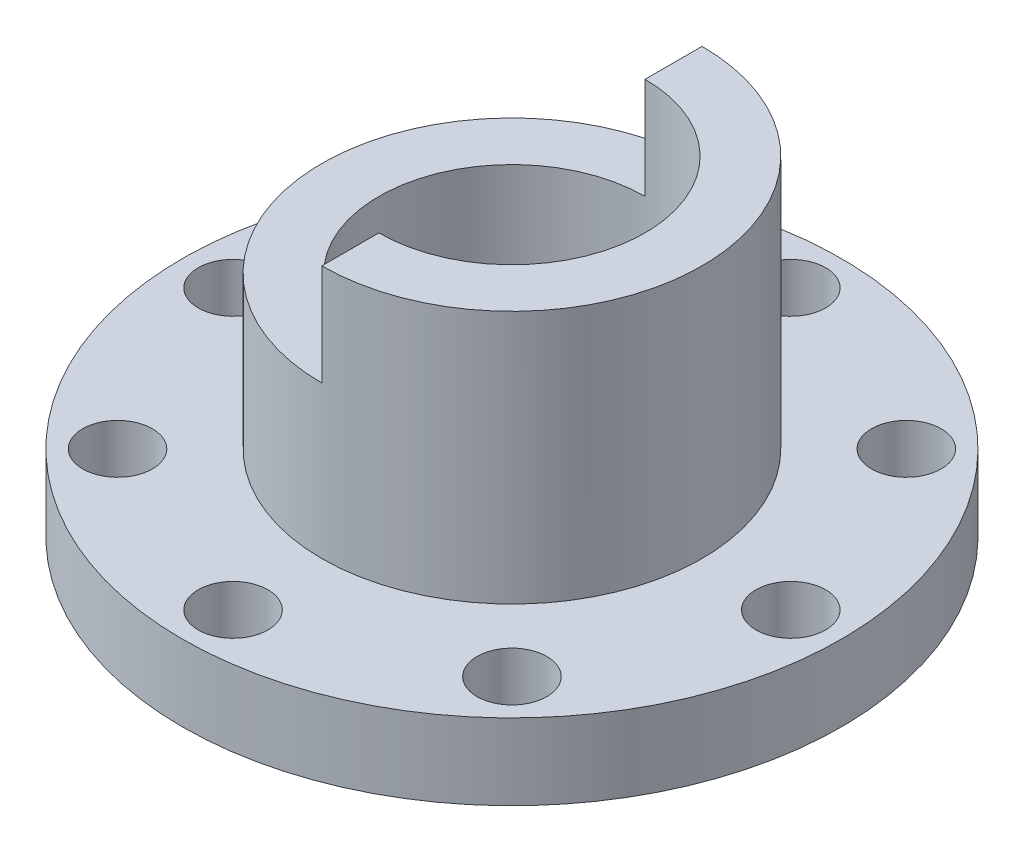
ISO-10303-21;
HEADER;
FILE_DESCRIPTION(('STEP AP214'),'2;1');
FILE_NAME('part.step','',(''),(''),'','','');
FILE_SCHEMA(('AUTOMOTIVE_DESIGN { 1 0 10303 214 1 1 1 1 }'));
ENDSEC;
DATA;
#1=APPLICATION_CONTEXT('core data for automotive mechanical design processes');
#2=APPLICATION_PROTOCOL_DEFINITION('international standard','automotive_design',2000,#1);
#3=PRODUCT_CONTEXT('',#1,'mechanical');
#4=PRODUCT('Part','Part','',(#3));
#5=PRODUCT_RELATED_PRODUCT_CATEGORY('part','',(#4));
#6=PRODUCT_DEFINITION_FORMATION('','',#4);
#7=PRODUCT_DEFINITION_CONTEXT('part definition',#1,'design');
#8=PRODUCT_DEFINITION('design','',#6,#7);
#9=PRODUCT_DEFINITION_SHAPE('','',#8);
#10=(LENGTH_UNIT() NAMED_UNIT(*) SI_UNIT(.MILLI.,.METRE.));
#11=(NAMED_UNIT(*) PLANE_ANGLE_UNIT() SI_UNIT($,.RADIAN.));
#12=(NAMED_UNIT(*) SI_UNIT($,.STERADIAN.) SOLID_ANGLE_UNIT());
#13=UNCERTAINTY_MEASURE_WITH_UNIT(LENGTH_MEASURE(1.E-05),#10,'distance_accuracy_value','');
#14=(GEOMETRIC_REPRESENTATION_CONTEXT(3) GLOBAL_UNCERTAINTY_ASSIGNED_CONTEXT((#13)) GLOBAL_UNIT_ASSIGNED_CONTEXT((#10,
#11,#12)) REPRESENTATION_CONTEXT('',''));
#15=CARTESIAN_POINT('',(0.,0.,0.));
#16=DIRECTION('',(0.,0.,1.));
#17=DIRECTION('',(1.,0.,0.));
#18=AXIS2_PLACEMENT_3D('',#15,#16,#17);
#19=CARTESIAN_POINT('',(0.,9.,0.));
#20=DIRECTION('',(0.,1.,0.));
#21=DIRECTION('',(0.,0.,1.));
#22=AXIS2_PLACEMENT_3D('',#19,#20,#21);
#23=PLANE('',#22);
#24=DIRECTION('',(0.,0.,1.));
#25=VECTOR('',#24,1.);
#26=CARTESIAN_POINT('',(0.,9.,0.));
#27=LINE('',#26,#25);
#28=CARTESIAN_POINT('',(0.,9.,-7.5));
#29=VERTEX_POINT('',#28);
#30=CARTESIAN_POINT('',(0.,9.,-5.25));
#31=VERTEX_POINT('',#30);
#32=EDGE_CURVE('E113',#29,#31,#27,.T.);
#33=ORIENTED_EDGE('',*,*,#32,.F.);
#34=CARTESIAN_POINT('',(0.,9.,0.));
#35=DIRECTION('',(0.,1.,0.));
#36=DIRECTION('',(0.,0.,1.));
#37=AXIS2_PLACEMENT_3D('',#34,#35,#36);
#38=CIRCLE('',#37,7.5);
#39=CARTESIAN_POINT('',(0.,9.,7.5));
#40=VERTEX_POINT('',#39);
#41=EDGE_CURVE('E94',#29,#40,#38,.T.);
#42=ORIENTED_EDGE('',*,*,#41,.T.);
#43=CARTESIAN_POINT('',(0.,9.,5.25));
#44=VERTEX_POINT('',#43);
#45=EDGE_CURVE('E57',#44,#40,#27,.T.);
#46=ORIENTED_EDGE('',*,*,#45,.F.);
#47=CARTESIAN_POINT('',(0.,9.,0.));
#48=DIRECTION('',(0.,1.,0.));
#49=DIRECTION('',(0.,0.,1.));
#50=AXIS2_PLACEMENT_3D('',#47,#48,#49);
#51=CIRCLE('',#50,5.25);
#52=EDGE_CURVE('E116',#44,#31,#51,.F.);
#53=ORIENTED_EDGE('',*,*,#52,.T.);
#54=EDGE_LOOP('',(#33,#42,#46,#53));
#55=FACE_BOUND('',#54,.T.);
#56=ADVANCED_FACE('F41',(#55),#23,.T.);
#57=CARTESIAN_POINT('',(0.,13.,0.));
#58=DIRECTION('',(0.,1.,0.));
#59=DIRECTION('',(0.,0.,1.));
#60=AXIS2_PLACEMENT_3D('',#57,#58,#59);
#61=PLANE('',#60);
#62=DIRECTION('',(0.,0.,1.));
#63=VECTOR('',#62,1.);
#64=CARTESIAN_POINT('',(0.,13.,0.));
#65=LINE('',#64,#63);
#66=CARTESIAN_POINT('',(0.,13.,5.25));
#67=VERTEX_POINT('',#66);
#68=CARTESIAN_POINT('',(0.,13.,7.5));
#69=VERTEX_POINT('',#68);
#70=EDGE_CURVE('E93',#67,#69,#65,.T.);
#71=ORIENTED_EDGE('',*,*,#70,.T.);
#72=CARTESIAN_POINT('',(0.,13.,0.));
#73=DIRECTION('',(0.,1.,0.));
#74=DIRECTION('',(0.,0.,1.));
#75=AXIS2_PLACEMENT_3D('',#72,#73,#74);
#76=CIRCLE('',#75,7.5);
#77=CARTESIAN_POINT('',(0.,13.,-7.5));
#78=VERTEX_POINT('',#77);
#79=EDGE_CURVE('E97',#69,#78,#76,.T.);
#80=ORIENTED_EDGE('',*,*,#79,.T.);
#81=CARTESIAN_POINT('',(0.,13.,-5.25));
#82=VERTEX_POINT('',#81);
#83=EDGE_CURVE('E82',#78,#82,#65,.T.);
#84=ORIENTED_EDGE('',*,*,#83,.T.);
#85=CARTESIAN_POINT('',(0.,13.,0.));
#86=DIRECTION('',(0.,1.,0.));
#87=DIRECTION('',(0.,0.,1.));
#88=AXIS2_PLACEMENT_3D('',#85,#86,#87);
#89=CIRCLE('',#88,5.25);
#90=EDGE_CURVE('E122',#67,#82,#89,.T.);
#91=ORIENTED_EDGE('',*,*,#90,.F.);
#92=EDGE_LOOP('',(#71,#80,#84,#91));
#93=FACE_BOUND('',#92,.T.);
#94=ADVANCED_FACE('F98',(#93),#61,.T.);
#95=CARTESIAN_POINT('',(0.,9.,0.));
#96=DIRECTION('',(-1.,0.,0.));
#97=DIRECTION('',(0.,0.,1.));
#98=AXIS2_PLACEMENT_3D('',#95,#96,#97);
#99=PLANE('',#98);
#100=ORIENTED_EDGE('',*,*,#83,.F.);
#101=DIRECTION('',(0.,-1.,0.));
#102=VECTOR('',#101,1.);
#103=CARTESIAN_POINT('',(0.,13.,-7.5));
#104=LINE('',#103,#102);
#105=EDGE_CURVE('E86',#78,#29,#104,.T.);
#106=ORIENTED_EDGE('',*,*,#105,.T.);
#107=ORIENTED_EDGE('',*,*,#32,.T.);
#108=DIRECTION('',(0.,1.,0.));
#109=VECTOR('',#108,1.);
#110=CARTESIAN_POINT('',(0.,9.,-5.25));
#111=LINE('',#110,#109);
#112=EDGE_CURVE('E88',#31,#82,#111,.T.);
#113=ORIENTED_EDGE('',*,*,#112,.T.);
#114=EDGE_LOOP('',(#100,#106,#107,#113));
#115=FACE_BOUND('',#114,.T.);
#116=ADVANCED_FACE('F84',(#115),#99,.T.);
#117=ORIENTED_EDGE('',*,*,#45,.T.);
#118=DIRECTION('',(0.,-1.,0.));
#119=VECTOR('',#118,1.);
#120=CARTESIAN_POINT('',(0.,13.,7.5));
#121=LINE('',#120,#119);
#122=EDGE_CURVE('E102',#69,#40,#121,.T.);
#123=ORIENTED_EDGE('',*,*,#122,.F.);
#124=ORIENTED_EDGE('',*,*,#70,.F.);
#125=DIRECTION('',(0.,1.,0.));
#126=VECTOR('',#125,1.);
#127=CARTESIAN_POINT('',(0.,9.,5.25));
#128=LINE('',#127,#126);
#129=EDGE_CURVE('E118',#44,#67,#128,.T.);
#130=ORIENTED_EDGE('',*,*,#129,.F.);
#131=EDGE_LOOP('',(#117,#123,#124,#130));
#132=FACE_BOUND('',#131,.T.);
#133=ADVANCED_FACE('F228',(#132),#99,.T.);
#134=CARTESIAN_POINT('',(0.,-5.,0.));
#135=DIRECTION('',(0.,1.,0.));
#136=DIRECTION('',(0.,0.,1.));
#137=AXIS2_PLACEMENT_3D('',#134,#135,#136);
#138=CYLINDRICAL_SURFACE('',#137,5.25);
#139=ORIENTED_EDGE('',*,*,#112,.F.);
#140=ORIENTED_EDGE('',*,*,#52,.F.);
#141=ORIENTED_EDGE('',*,*,#129,.T.);
#142=ORIENTED_EDGE('',*,*,#90,.T.);
#143=EDGE_LOOP('',(#139,#140,#141,#142));
#144=FACE_BOUND('',#143,.T.);
#145=CARTESIAN_POINT('',(0.,0.,0.));
#146=DIRECTION('',(0.,1.,0.));
#147=DIRECTION('',(0.,0.,1.));
#148=AXIS2_PLACEMENT_3D('',#145,#146,#147);
#149=CIRCLE('',#148,5.25);
#150=CARTESIAN_POINT('',(0.,0.,5.25));
#151=VERTEX_POINT('',#150);
#152=EDGE_CURVE('E128',#151,#151,#149,.T.);
#153=ORIENTED_EDGE('',*,*,#152,.F.);
#154=EDGE_LOOP('',(#153));
#155=FACE_BOUND('',#154,.T.);
#156=ADVANCED_FACE('F229',(#144,#155),#138,.F.);
#157=CARTESIAN_POINT('',(0.,3.,0.));
#158=DIRECTION('',(0.,1.,0.));
#159=DIRECTION('',(0.,0.,1.));
#160=AXIS2_PLACEMENT_3D('',#157,#158,#159);
#161=PLANE('',#160);
#162=CARTESIAN_POINT('',(0.,3.,0.));
#163=DIRECTION('',(0.,1.,0.));
#164=DIRECTION('',(0.,0.,1.));
#165=AXIS2_PLACEMENT_3D('',#162,#163,#164);
#166=CIRCLE('',#165,7.5);
#167=CARTESIAN_POINT('',(0.,3.,7.5));
#168=VERTEX_POINT('',#167);
#169=EDGE_CURVE('E11',#168,#168,#166,.T.);
#170=ORIENTED_EDGE('',*,*,#169,.F.);
#171=EDGE_LOOP('',(#170));
#172=FACE_BOUND('',#171,.T.);
#173=CARTESIAN_POINT('',(0.,3.,0.));
#174=DIRECTION('',(0.,1.,0.));
#175=DIRECTION('',(0.,0.,1.));
#176=AXIS2_PLACEMENT_3D('',#173,#174,#175);
#177=CIRCLE('',#176,13.);
#178=CARTESIAN_POINT('',(0.,3.,13.));
#179=VERTEX_POINT('',#178);
#180=EDGE_CURVE('E50',#179,#179,#177,.T.);
#181=ORIENTED_EDGE('',*,*,#180,.T.);
#182=EDGE_LOOP('',(#181));
#183=FACE_BOUND('',#182,.T.);
#184=CARTESIAN_POINT('',(-7.77817459305189,3.,-7.77817459305169));
#185=DIRECTION('',(0.,1.,0.));
#186=DIRECTION('',(0.,0.,1.));
#187=AXIS2_PLACEMENT_3D('',#184,#185,#186);
#188=CIRCLE('',#187,1.37500000000036);
#189=CARTESIAN_POINT('',(-7.77817459305189,3.,-6.40317459305133));
#190=VERTEX_POINT('',#189);
#191=EDGE_CURVE('E162',#190,#190,#188,.T.);
#192=ORIENTED_EDGE('',*,*,#191,.F.);
#193=EDGE_LOOP('',(#192));
#194=FACE_BOUND('',#193,.T.);
#195=CARTESIAN_POINT('',(0.,3.,-11.));
#196=DIRECTION('',(0.,1.,0.));
#197=DIRECTION('',(0.,0.,1.));
#198=AXIS2_PLACEMENT_3D('',#195,#196,#197);
#199=CIRCLE('',#198,1.375);
#200=CARTESIAN_POINT('',(0.,3.,-9.625));
#201=VERTEX_POINT('',#200);
#202=EDGE_CURVE('E158',#201,#201,#199,.T.);
#203=ORIENTED_EDGE('',*,*,#202,.F.);
#204=EDGE_LOOP('',(#203));
#205=FACE_BOUND('',#204,.T.);
#206=CARTESIAN_POINT('',(7.77817459305216,3.,-7.77817459305235));
#207=DIRECTION('',(0.,1.,0.));
#208=DIRECTION('',(0.,0.,1.));
#209=AXIS2_PLACEMENT_3D('',#206,#207,#208);
#210=CIRCLE('',#209,1.37500000000005);
#211=CARTESIAN_POINT('',(7.77817459305216,3.,-6.4031745930523));
#212=VERTEX_POINT('',#211);
#213=EDGE_CURVE('E154',#212,#212,#210,.T.);
#214=ORIENTED_EDGE('',*,*,#213,.F.);
#215=EDGE_LOOP('',(#214));
#216=FACE_BOUND('',#215,.T.);
#217=CARTESIAN_POINT('',(11.0000000000005,3.,-4.66937538383073E-13));
#218=DIRECTION('',(0.,1.,0.));
#219=DIRECTION('',(0.,0.,1.));
#220=AXIS2_PLACEMENT_3D('',#217,#218,#219);
#221=CIRCLE('',#220,1.37500000000035);
#222=CARTESIAN_POINT('',(11.0000000000005,3.,1.37499999999988));
#223=VERTEX_POINT('',#222);
#224=EDGE_CURVE('E150',#223,#223,#221,.T.);
#225=ORIENTED_EDGE('',*,*,#224,.F.);
#226=EDGE_LOOP('',(#225));
#227=FACE_BOUND('',#226,.T.);
#228=CARTESIAN_POINT('',(7.77817459305282,3.,7.77817459305169));
#229=DIRECTION('',(0.,1.,0.));
#230=DIRECTION('',(0.,0.,1.));
#231=AXIS2_PLACEMENT_3D('',#228,#229,#230);
#232=CIRCLE('',#231,1.37500000000072);
#233=CARTESIAN_POINT('',(7.77817459305282,3.,9.15317459305241));
#234=VERTEX_POINT('',#233);
#235=EDGE_CURVE('E146',#234,#234,#232,.T.);
#236=ORIENTED_EDGE('',*,*,#235,.F.);
#237=EDGE_LOOP('',(#236));
#238=FACE_BOUND('',#237,.T.);
#239=CARTESIAN_POINT('',(9.33875076766146E-13,3.,11.));
#240=DIRECTION('',(0.,1.,0.));
#241=DIRECTION('',(0.,0.,1.));
#242=AXIS2_PLACEMENT_3D('',#239,#240,#241);
#243=CIRCLE('',#242,1.37500000000097);
#244=CARTESIAN_POINT('',(9.33875076766146E-13,3.,12.375000000001));
#245=VERTEX_POINT('',#244);
#246=EDGE_CURVE('E142',#245,#245,#243,.T.);
#247=ORIENTED_EDGE('',*,*,#246,.F.);
#248=EDGE_LOOP('',(#247));
#249=FACE_BOUND('',#248,.T.);
#250=CARTESIAN_POINT('',(-7.77817459305123,3.,7.77817459305236));
#251=DIRECTION('',(0.,1.,0.));
#252=DIRECTION('',(0.,0.,1.));
#253=AXIS2_PLACEMENT_3D('',#250,#251,#252);
#254=CIRCLE('',#253,1.37500000000095);
#255=CARTESIAN_POINT('',(-7.77817459305123,3.,9.15317459305331));
#256=VERTEX_POINT('',#255);
#257=EDGE_CURVE('E137',#256,#256,#254,.T.);
#258=ORIENTED_EDGE('',*,*,#257,.F.);
#259=EDGE_LOOP('',(#258));
#260=FACE_BOUND('',#259,.T.);
#261=CARTESIAN_POINT('',(-10.9999999999995,3.,4.68284649862135E-13));
#262=DIRECTION('',(0.,1.,0.));
#263=DIRECTION('',(0.,0.,1.));
#264=AXIS2_PLACEMENT_3D('',#261,#262,#263);
#265=CIRCLE('',#264,1.37500000000069);
#266=CARTESIAN_POINT('',(-10.9999999999995,3.,1.37500000000116));
#267=VERTEX_POINT('',#266);
#268=EDGE_CURVE('E133',#267,#267,#265,.T.);
#269=ORIENTED_EDGE('',*,*,#268,.F.);
#270=EDGE_LOOP('',(#269));
#271=FACE_BOUND('',#270,.T.);
#272=ADVANCED_FACE('F231',(#172,#183,#194,#205,#216,#227,#238,#249,#260,#271),#161,.T.);
#273=CARTESIAN_POINT('',(-7.77817459305189,3.,-7.77817459305169));
#274=DIRECTION('',(0.,-1.,0.));
#275=DIRECTION('',(0.,0.,-1.));
#276=AXIS2_PLACEMENT_3D('',#273,#274,#275);
#277=CYLINDRICAL_SURFACE('',#276,1.37500000000036);
#278=ORIENTED_EDGE('',*,*,#191,.T.);
#279=EDGE_LOOP('',(#278));
#280=FACE_BOUND('',#279,.T.);
#281=CARTESIAN_POINT('',(-7.77817459305189,0.,-7.77817459305169));
#282=DIRECTION('',(0.,1.,0.));
#283=DIRECTION('',(0.,0.,1.));
#284=AXIS2_PLACEMENT_3D('',#281,#282,#283);
#285=CIRCLE('',#284,1.37500000000036);
#286=CARTESIAN_POINT('',(-7.77817459305189,0.,-6.40317459305133));
#287=VERTEX_POINT('',#286);
#288=EDGE_CURVE('E196',#287,#287,#285,.T.);
#289=ORIENTED_EDGE('',*,*,#288,.F.);
#290=EDGE_LOOP('',(#289));
#291=FACE_BOUND('',#290,.T.);
#292=ADVANCED_FACE('F234',(#280,#291),#277,.F.);
#293=CARTESIAN_POINT('',(0.,3.,-11.));
#294=DIRECTION('',(0.,-1.,0.));
#295=DIRECTION('',(0.,0.,-1.));
#296=AXIS2_PLACEMENT_3D('',#293,#294,#295);
#297=CYLINDRICAL_SURFACE('',#296,1.375);
#298=ORIENTED_EDGE('',*,*,#202,.T.);
#299=EDGE_LOOP('',(#298));
#300=FACE_BOUND('',#299,.T.);
#301=CARTESIAN_POINT('',(0.,0.,-11.));
#302=DIRECTION('',(0.,1.,0.));
#303=DIRECTION('',(0.,0.,1.));
#304=AXIS2_PLACEMENT_3D('',#301,#302,#303);
#305=CIRCLE('',#304,1.375);
#306=CARTESIAN_POINT('',(0.,0.,-9.625));
#307=VERTEX_POINT('',#306);
#308=EDGE_CURVE('E192',#307,#307,#305,.T.);
#309=ORIENTED_EDGE('',*,*,#308,.F.);
#310=EDGE_LOOP('',(#309));
#311=FACE_BOUND('',#310,.T.);
#312=ADVANCED_FACE('F239',(#300,#311),#297,.F.);
#313=CARTESIAN_POINT('',(7.77817459305216,3.,-7.77817459305235));
#314=DIRECTION('',(0.,-1.,0.));
#315=DIRECTION('',(0.,0.,-1.));
#316=AXIS2_PLACEMENT_3D('',#313,#314,#315);
#317=CYLINDRICAL_SURFACE('',#316,1.37500000000005);
#318=ORIENTED_EDGE('',*,*,#213,.T.);
#319=EDGE_LOOP('',(#318));
#320=FACE_BOUND('',#319,.T.);
#321=CARTESIAN_POINT('',(7.77817459305216,0.,-7.77817459305235));
#322=DIRECTION('',(0.,1.,0.));
#323=DIRECTION('',(0.,0.,1.));
#324=AXIS2_PLACEMENT_3D('',#321,#322,#323);
#325=CIRCLE('',#324,1.37500000000005);
#326=CARTESIAN_POINT('',(7.77817459305216,0.,-6.4031745930523));
#327=VERTEX_POINT('',#326);
#328=EDGE_CURVE('E188',#327,#327,#325,.T.);
#329=ORIENTED_EDGE('',*,*,#328,.F.);
#330=EDGE_LOOP('',(#329));
#331=FACE_BOUND('',#330,.T.);
#332=ADVANCED_FACE('F283',(#320,#331),#317,.F.);
#333=CARTESIAN_POINT('',(11.0000000000005,3.,-4.66937538383073E-13));
#334=DIRECTION('',(0.,-1.,0.));
#335=DIRECTION('',(0.,0.,-1.));
#336=AXIS2_PLACEMENT_3D('',#333,#334,#335);
#337=CYLINDRICAL_SURFACE('',#336,1.37500000000035);
#338=ORIENTED_EDGE('',*,*,#224,.T.);
#339=EDGE_LOOP('',(#338));
#340=FACE_BOUND('',#339,.T.);
#341=CARTESIAN_POINT('',(11.0000000000005,0.,-4.66937538383073E-13));
#342=DIRECTION('',(0.,1.,0.));
#343=DIRECTION('',(0.,0.,1.));
#344=AXIS2_PLACEMENT_3D('',#341,#342,#343);
#345=CIRCLE('',#344,1.37500000000035);
#346=CARTESIAN_POINT('',(11.0000000000005,0.,1.37499999999988));
#347=VERTEX_POINT('',#346);
#348=EDGE_CURVE('E184',#347,#347,#345,.T.);
#349=ORIENTED_EDGE('',*,*,#348,.F.);
#350=EDGE_LOOP('',(#349));
#351=FACE_BOUND('',#350,.T.);
#352=ADVANCED_FACE('F289',(#340,#351),#337,.F.);
#353=CARTESIAN_POINT('',(7.77817459305282,3.,7.77817459305169));
#354=DIRECTION('',(0.,-1.,0.));
#355=DIRECTION('',(0.,0.,-1.));
#356=AXIS2_PLACEMENT_3D('',#353,#354,#355);
#357=CYLINDRICAL_SURFACE('',#356,1.37500000000072);
#358=ORIENTED_EDGE('',*,*,#235,.T.);
#359=EDGE_LOOP('',(#358));
#360=FACE_BOUND('',#359,.T.);
#361=CARTESIAN_POINT('',(7.77817459305282,0.,7.77817459305169));
#362=DIRECTION('',(0.,1.,0.));
#363=DIRECTION('',(0.,0.,1.));
#364=AXIS2_PLACEMENT_3D('',#361,#362,#363);
#365=CIRCLE('',#364,1.37500000000072);
#366=CARTESIAN_POINT('',(7.77817459305282,0.,9.15317459305241));
#367=VERTEX_POINT('',#366);
#368=EDGE_CURVE('E180',#367,#367,#365,.T.);
#369=ORIENTED_EDGE('',*,*,#368,.F.);
#370=EDGE_LOOP('',(#369));
#371=FACE_BOUND('',#370,.T.);
#372=ADVANCED_FACE('F295',(#360,#371),#357,.F.);
#373=CARTESIAN_POINT('',(9.33875076766146E-13,3.,11.));
#374=DIRECTION('',(0.,-1.,0.));
#375=DIRECTION('',(0.,0.,-1.));
#376=AXIS2_PLACEMENT_3D('',#373,#374,#375);
#377=CYLINDRICAL_SURFACE('',#376,1.37500000000097);
#378=ORIENTED_EDGE('',*,*,#246,.T.);
#379=EDGE_LOOP('',(#378));
#380=FACE_BOUND('',#379,.T.);
#381=CARTESIAN_POINT('',(9.33875076766146E-13,0.,11.));
#382=DIRECTION('',(0.,1.,0.));
#383=DIRECTION('',(0.,0.,1.));
#384=AXIS2_PLACEMENT_3D('',#381,#382,#383);
#385=CIRCLE('',#384,1.37500000000097);
#386=CARTESIAN_POINT('',(9.33875076766146E-13,0.,12.375000000001));
#387=VERTEX_POINT('',#386);
#388=EDGE_CURVE('E176',#387,#387,#385,.T.);
#389=ORIENTED_EDGE('',*,*,#388,.F.);
#390=EDGE_LOOP('',(#389));
#391=FACE_BOUND('',#390,.T.);
#392=ADVANCED_FACE('F299',(#380,#391),#377,.F.);
#393=CARTESIAN_POINT('',(-7.77817459305123,3.,7.77817459305236));
#394=DIRECTION('',(0.,-1.,0.));
#395=DIRECTION('',(0.,0.,-1.));
#396=AXIS2_PLACEMENT_3D('',#393,#394,#395);
#397=CYLINDRICAL_SURFACE('',#396,1.37500000000095);
#398=ORIENTED_EDGE('',*,*,#257,.T.);
#399=EDGE_LOOP('',(#398));
#400=FACE_BOUND('',#399,.T.);
#401=CARTESIAN_POINT('',(-7.77817459305123,0.,7.77817459305236));
#402=DIRECTION('',(0.,1.,0.));
#403=DIRECTION('',(0.,0.,1.));
#404=AXIS2_PLACEMENT_3D('',#401,#402,#403);
#405=CIRCLE('',#404,1.37500000000095);
#406=CARTESIAN_POINT('',(-7.77817459305123,0.,9.15317459305331));
#407=VERTEX_POINT('',#406);
#408=EDGE_CURVE('E172',#407,#407,#405,.T.);
#409=ORIENTED_EDGE('',*,*,#408,.F.);
#410=EDGE_LOOP('',(#409));
#411=FACE_BOUND('',#410,.T.);
#412=ADVANCED_FACE('F264',(#400,#411),#397,.F.);
#413=CARTESIAN_POINT('',(-10.9999999999995,3.,4.68284649862135E-13));
#414=DIRECTION('',(0.,-1.,0.));
#415=DIRECTION('',(0.,0.,-1.));
#416=AXIS2_PLACEMENT_3D('',#413,#414,#415);
#417=CYLINDRICAL_SURFACE('',#416,1.37500000000069);
#418=ORIENTED_EDGE('',*,*,#268,.T.);
#419=EDGE_LOOP('',(#418));
#420=FACE_BOUND('',#419,.T.);
#421=CARTESIAN_POINT('',(-10.9999999999995,0.,4.68284649862135E-13));
#422=DIRECTION('',(0.,1.,0.));
#423=DIRECTION('',(0.,0.,1.));
#424=AXIS2_PLACEMENT_3D('',#421,#422,#423);
#425=CIRCLE('',#424,1.37500000000069);
#426=CARTESIAN_POINT('',(-10.9999999999995,0.,1.37500000000116));
#427=VERTEX_POINT('',#426);
#428=EDGE_CURVE('E132',#427,#427,#425,.T.);
#429=ORIENTED_EDGE('',*,*,#428,.F.);
#430=EDGE_LOOP('',(#429));
#431=FACE_BOUND('',#430,.T.);
#432=ADVANCED_FACE('F43',(#420,#431),#417,.F.);
#433=CARTESIAN_POINT('',(0.,3.,0.));
#434=DIRECTION('',(0.,-1.,0.));
#435=DIRECTION('',(0.,0.,-1.));
#436=AXIS2_PLACEMENT_3D('',#433,#434,#435);
#437=CYLINDRICAL_SURFACE('',#436,13.);
#438=ORIENTED_EDGE('',*,*,#180,.F.);
#439=EDGE_LOOP('',(#438));
#440=FACE_BOUND('',#439,.T.);
#441=CARTESIAN_POINT('',(0.,0.,0.));
#442=DIRECTION('',(0.,1.,0.));
#443=DIRECTION('',(0.,0.,1.));
#444=AXIS2_PLACEMENT_3D('',#441,#442,#443);
#445=CIRCLE('',#444,13.);
#446=CARTESIAN_POINT('',(0.,0.,13.));
#447=VERTEX_POINT('',#446);
#448=EDGE_CURVE('E138',#447,#447,#445,.T.);
#449=ORIENTED_EDGE('',*,*,#448,.T.);
#450=EDGE_LOOP('',(#449));
#451=FACE_BOUND('',#450,.T.);
#452=ADVANCED_FACE('F203',(#440,#451),#437,.T.);
#453=CARTESIAN_POINT('',(0.,0.,0.));
#454=DIRECTION('',(0.,1.,0.));
#455=DIRECTION('',(0.,0.,1.));
#456=AXIS2_PLACEMENT_3D('',#453,#454,#455);
#457=PLANE('',#456);
#458=ORIENTED_EDGE('',*,*,#152,.T.);
#459=EDGE_LOOP('',(#458));
#460=FACE_BOUND('',#459,.T.);
#461=ORIENTED_EDGE('',*,*,#428,.T.);
#462=EDGE_LOOP('',(#461));
#463=FACE_BOUND('',#462,.T.);
#464=ORIENTED_EDGE('',*,*,#408,.T.);
#465=EDGE_LOOP('',(#464));
#466=FACE_BOUND('',#465,.T.);
#467=ORIENTED_EDGE('',*,*,#388,.T.);
#468=EDGE_LOOP('',(#467));
#469=FACE_BOUND('',#468,.T.);
#470=ORIENTED_EDGE('',*,*,#368,.T.);
#471=EDGE_LOOP('',(#470));
#472=FACE_BOUND('',#471,.T.);
#473=ORIENTED_EDGE('',*,*,#348,.T.);
#474=EDGE_LOOP('',(#473));
#475=FACE_BOUND('',#474,.T.);
#476=ORIENTED_EDGE('',*,*,#328,.T.);
#477=EDGE_LOOP('',(#476));
#478=FACE_BOUND('',#477,.T.);
#479=ORIENTED_EDGE('',*,*,#308,.T.);
#480=EDGE_LOOP('',(#479));
#481=FACE_BOUND('',#480,.T.);
#482=ORIENTED_EDGE('',*,*,#288,.T.);
#483=EDGE_LOOP('',(#482));
#484=FACE_BOUND('',#483,.T.);
#485=ORIENTED_EDGE('',*,*,#448,.F.);
#486=EDGE_LOOP('',(#485));
#487=FACE_BOUND('',#486,.T.);
#488=ADVANCED_FACE('F205',(#460,#463,#466,#469,#472,#475,#478,#481,#484,#487),#457,.F.);
#489=CARTESIAN_POINT('',(0.,3.,0.));
#490=DIRECTION('',(0.,1.,0.));
#491=DIRECTION('',(0.,0.,1.));
#492=AXIS2_PLACEMENT_3D('',#489,#490,#491);
#493=CYLINDRICAL_SURFACE('',#492,7.5);
#494=ORIENTED_EDGE('',*,*,#169,.T.);
#495=EDGE_LOOP('',(#494));
#496=FACE_BOUND('',#495,.T.);
#497=ORIENTED_EDGE('',*,*,#41,.F.);
#498=ORIENTED_EDGE('',*,*,#105,.F.);
#499=ORIENTED_EDGE('',*,*,#79,.F.);
#500=ORIENTED_EDGE('',*,*,#122,.T.);
#501=EDGE_LOOP('',(#497,#498,#499,#500));
#502=FACE_BOUND('',#501,.T.);
#503=ADVANCED_FACE('F105',(#496,#502),#493,.T.);
#504=CLOSED_SHELL('',(#56,#94,#116,#133,#156,#272,#292,#312,#332,#352,#372,#392,#412,#432,#452,
#488,#503));
#505=MANIFOLD_SOLID_BREP('B2',#504);
#506=ADVANCED_BREP_SHAPE_REPRESENTATION('',(#18,#505),#14);
#507=SHAPE_DEFINITION_REPRESENTATION(#9,#506);
ENDSEC;
END-ISO-10303-21;
